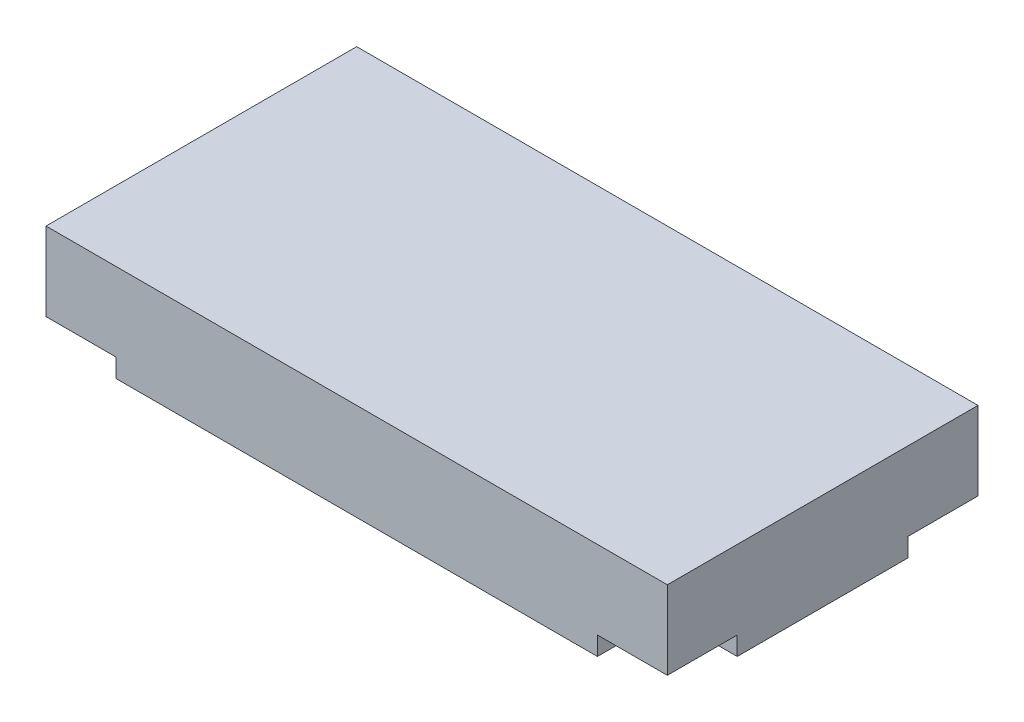
ISO-10303-21;
HEADER;
FILE_DESCRIPTION(('STEP AP214'),'2;1');
FILE_NAME('part.step','',(''),(''),'','','');
FILE_SCHEMA(('AUTOMOTIVE_DESIGN { 1 0 10303 214 1 1 1 1 }'));
ENDSEC;
DATA;
#1=APPLICATION_CONTEXT('core data for automotive mechanical design processes');
#2=APPLICATION_PROTOCOL_DEFINITION('international standard','automotive_design',2000,#1);
#3=PRODUCT_CONTEXT('',#1,'mechanical');
#4=PRODUCT('Part','Part','',(#3));
#5=PRODUCT_RELATED_PRODUCT_CATEGORY('part','',(#4));
#6=PRODUCT_DEFINITION_FORMATION('','',#4);
#7=PRODUCT_DEFINITION_CONTEXT('part definition',#1,'design');
#8=PRODUCT_DEFINITION('design','',#6,#7);
#9=PRODUCT_DEFINITION_SHAPE('','',#8);
#10=(LENGTH_UNIT() NAMED_UNIT(*) SI_UNIT(.MILLI.,.METRE.));
#11=(NAMED_UNIT(*) PLANE_ANGLE_UNIT() SI_UNIT($,.RADIAN.));
#12=(NAMED_UNIT(*) SI_UNIT($,.STERADIAN.) SOLID_ANGLE_UNIT());
#13=UNCERTAINTY_MEASURE_WITH_UNIT(LENGTH_MEASURE(1.E-05),#10,'distance_accuracy_value','');
#14=(GEOMETRIC_REPRESENTATION_CONTEXT(3) GLOBAL_UNCERTAINTY_ASSIGNED_CONTEXT((#13)) GLOBAL_UNIT_ASSIGNED_CONTEXT((#10,
#11,#12)) REPRESENTATION_CONTEXT('',''));
#15=CARTESIAN_POINT('',(0.,0.,0.));
#16=DIRECTION('',(0.,0.,1.));
#17=DIRECTION('',(1.,0.,0.));
#18=AXIS2_PLACEMENT_3D('',#15,#16,#17);
#19=CARTESIAN_POINT('',(20.,6.25,-10.));
#20=DIRECTION('',(-1.,0.,0.));
#21=DIRECTION('',(0.,0.,1.));
#22=AXIS2_PLACEMENT_3D('',#19,#20,#21);
#23=PLANE('',#22);
#24=DIRECTION('',(0.,0.,-1.));
#25=VECTOR('',#24,1.);
#26=CARTESIAN_POINT('',(20.,0.,-10.));
#27=LINE('',#26,#25);
#28=CARTESIAN_POINT('',(20.,0.,5.5));
#29=VERTEX_POINT('',#28);
#30=CARTESIAN_POINT('',(20.,0.,-5.5));
#31=VERTEX_POINT('',#30);
#32=EDGE_CURVE('E290',#29,#31,#27,.T.);
#33=ORIENTED_EDGE('',*,*,#32,.T.);
#34=DIRECTION('',(0.,-1.,0.));
#35=VECTOR('',#34,1.);
#36=CARTESIAN_POINT('',(20.,1.2,-5.5));
#37=LINE('',#36,#35);
#38=CARTESIAN_POINT('',(20.,1.2,-5.5));
#39=VERTEX_POINT('',#38);
#40=EDGE_CURVE('E232',#39,#31,#37,.T.);
#41=ORIENTED_EDGE('',*,*,#40,.F.);
#42=DIRECTION('',(0.,0.,1.));
#43=VECTOR('',#42,1.);
#44=CARTESIAN_POINT('',(20.,1.2,-10.));
#45=LINE('',#44,#43);
#46=CARTESIAN_POINT('',(20.,1.2,-10.));
#47=VERTEX_POINT('',#46);
#48=EDGE_CURVE('E219',#47,#39,#45,.T.);
#49=ORIENTED_EDGE('',*,*,#48,.F.);
#50=DIRECTION('',(0.,-1.,0.));
#51=VECTOR('',#50,1.);
#52=CARTESIAN_POINT('',(20.,6.25,-10.));
#53=LINE('',#52,#51);
#54=CARTESIAN_POINT('',(20.,6.25,-10.));
#55=VERTEX_POINT('',#54);
#56=EDGE_CURVE('E11',#55,#47,#53,.T.);
#57=ORIENTED_EDGE('',*,*,#56,.F.);
#58=DIRECTION('',(0.,0.,-1.));
#59=VECTOR('',#58,1.);
#60=CARTESIAN_POINT('',(20.,6.25,-10.));
#61=LINE('',#60,#59);
#62=CARTESIAN_POINT('',(20.,6.25,10.));
#63=VERTEX_POINT('',#62);
#64=EDGE_CURVE('E296',#63,#55,#61,.T.);
#65=ORIENTED_EDGE('',*,*,#64,.F.);
#66=DIRECTION('',(0.,-1.,0.));
#67=VECTOR('',#66,1.);
#68=CARTESIAN_POINT('',(20.,6.25,10.));
#69=LINE('',#68,#67);
#70=CARTESIAN_POINT('',(20.,1.2,10.));
#71=VERTEX_POINT('',#70);
#72=EDGE_CURVE('E306',#63,#71,#69,.T.);
#73=ORIENTED_EDGE('',*,*,#72,.T.);
#74=DIRECTION('',(0.,0.,1.));
#75=VECTOR('',#74,1.);
#76=CARTESIAN_POINT('',(20.,1.2,10.));
#77=LINE('',#76,#75);
#78=CARTESIAN_POINT('',(20.,1.2,5.5));
#79=VERTEX_POINT('',#78);
#80=EDGE_CURVE('E187',#79,#71,#77,.T.);
#81=ORIENTED_EDGE('',*,*,#80,.F.);
#82=DIRECTION('',(0.,-1.,0.));
#83=VECTOR('',#82,1.);
#84=CARTESIAN_POINT('',(20.,1.2,5.5));
#85=LINE('',#84,#83);
#86=EDGE_CURVE('E178',#79,#29,#85,.T.);
#87=ORIENTED_EDGE('',*,*,#86,.T.);
#88=EDGE_LOOP('',(#33,#41,#49,#57,#65,#73,#81,#87));
#89=FACE_BOUND('',#88,.T.);
#90=ADVANCED_FACE('F32',(#89),#23,.F.);
#91=CARTESIAN_POINT('',(-20.,6.25,-10.));
#92=DIRECTION('',(0.,0.,1.));
#93=DIRECTION('',(1.,0.,0.));
#94=AXIS2_PLACEMENT_3D('',#91,#92,#93);
#95=PLANE('',#94);
#96=DIRECTION('',(-1.,0.,0.));
#97=VECTOR('',#96,1.);
#98=CARTESIAN_POINT('',(-20.,0.,-10.));
#99=LINE('',#98,#97);
#100=CARTESIAN_POINT('',(15.5,0.,-10.));
#101=VERTEX_POINT('',#100);
#102=CARTESIAN_POINT('',(-15.5,0.,-10.));
#103=VERTEX_POINT('',#102);
#104=EDGE_CURVE('E309',#101,#103,#99,.T.);
#105=ORIENTED_EDGE('',*,*,#104,.T.);
#106=DIRECTION('',(0.,-1.,0.));
#107=VECTOR('',#106,1.);
#108=CARTESIAN_POINT('',(-15.5,1.2,-10.));
#109=LINE('',#108,#107);
#110=CARTESIAN_POINT('',(-15.5,1.2,-10.));
#111=VERTEX_POINT('',#110);
#112=EDGE_CURVE('E259',#111,#103,#109,.T.);
#113=ORIENTED_EDGE('',*,*,#112,.F.);
#114=DIRECTION('',(1.,0.,0.));
#115=VECTOR('',#114,1.);
#116=CARTESIAN_POINT('',(-20.,1.2,-10.));
#117=LINE('',#116,#115);
#118=CARTESIAN_POINT('',(-20.,1.2,-10.));
#119=VERTEX_POINT('',#118);
#120=EDGE_CURVE('E247',#119,#111,#117,.T.);
#121=ORIENTED_EDGE('',*,*,#120,.F.);
#122=DIRECTION('',(0.,-1.,0.));
#123=VECTOR('',#122,1.);
#124=CARTESIAN_POINT('',(-20.,6.25,-10.));
#125=LINE('',#124,#123);
#126=CARTESIAN_POINT('',(-20.,6.25,-10.));
#127=VERTEX_POINT('',#126);
#128=EDGE_CURVE('E39',#127,#119,#125,.T.);
#129=ORIENTED_EDGE('',*,*,#128,.F.);
#130=DIRECTION('',(-1.,0.,0.));
#131=VECTOR('',#130,1.);
#132=CARTESIAN_POINT('',(-20.,6.25,-10.));
#133=LINE('',#132,#131);
#134=EDGE_CURVE('E299',#55,#127,#133,.T.);
#135=ORIENTED_EDGE('',*,*,#134,.F.);
#136=ORIENTED_EDGE('',*,*,#56,.T.);
#137=DIRECTION('',(1.,0.,0.));
#138=VECTOR('',#137,1.);
#139=CARTESIAN_POINT('',(20.,1.2,-10.));
#140=LINE('',#139,#138);
#141=CARTESIAN_POINT('',(15.5,1.2,-10.));
#142=VERTEX_POINT('',#141);
#143=EDGE_CURVE('E217',#142,#47,#140,.T.);
#144=ORIENTED_EDGE('',*,*,#143,.F.);
#145=DIRECTION('',(0.,-1.,0.));
#146=VECTOR('',#145,1.);
#147=CARTESIAN_POINT('',(15.5,1.2,-10.));
#148=LINE('',#147,#146);
#149=EDGE_CURVE('E234',#142,#101,#148,.T.);
#150=ORIENTED_EDGE('',*,*,#149,.T.);
#151=EDGE_LOOP('',(#105,#113,#121,#129,#135,#136,#144,#150));
#152=FACE_BOUND('',#151,.T.);
#153=ADVANCED_FACE('F330',(#152),#95,.F.);
#154=CARTESIAN_POINT('',(-20.,6.25,-10.));
#155=DIRECTION('',(1.,0.,0.));
#156=DIRECTION('',(0.,0.,-1.));
#157=AXIS2_PLACEMENT_3D('',#154,#155,#156);
#158=PLANE('',#157);
#159=DIRECTION('',(0.,0.,-1.));
#160=VECTOR('',#159,1.);
#161=CARTESIAN_POINT('',(-20.,1.2,-10.));
#162=LINE('',#161,#160);
#163=CARTESIAN_POINT('',(-20.,1.2,-5.5));
#164=VERTEX_POINT('',#163);
#165=EDGE_CURVE('E245',#164,#119,#162,.T.);
#166=ORIENTED_EDGE('',*,*,#165,.F.);
#167=DIRECTION('',(0.,-1.,0.));
#168=VECTOR('',#167,1.);
#169=CARTESIAN_POINT('',(-20.,1.2,-5.5));
#170=LINE('',#169,#168);
#171=CARTESIAN_POINT('',(-20.,0.,-5.5));
#172=VERTEX_POINT('',#171);
#173=EDGE_CURVE('E261',#164,#172,#170,.T.);
#174=ORIENTED_EDGE('',*,*,#173,.T.);
#175=DIRECTION('',(0.,0.,1.));
#176=VECTOR('',#175,1.);
#177=CARTESIAN_POINT('',(-20.,0.,-10.));
#178=LINE('',#177,#176);
#179=CARTESIAN_POINT('',(-20.,0.,5.5));
#180=VERTEX_POINT('',#179);
#181=EDGE_CURVE('E312',#172,#180,#178,.T.);
#182=ORIENTED_EDGE('',*,*,#181,.T.);
#183=DIRECTION('',(0.,-1.,0.));
#184=VECTOR('',#183,1.);
#185=CARTESIAN_POINT('',(-20.,1.2,5.5));
#186=LINE('',#185,#184);
#187=CARTESIAN_POINT('',(-20.,1.2,5.5));
#188=VERTEX_POINT('',#187);
#189=EDGE_CURVE('E280',#188,#180,#186,.T.);
#190=ORIENTED_EDGE('',*,*,#189,.F.);
#191=DIRECTION('',(0.,0.,-1.));
#192=VECTOR('',#191,1.);
#193=CARTESIAN_POINT('',(-20.,1.2,10.));
#194=LINE('',#193,#192);
#195=CARTESIAN_POINT('',(-20.,1.2,10.));
#196=VERTEX_POINT('',#195);
#197=EDGE_CURVE('E265',#196,#188,#194,.T.);
#198=ORIENTED_EDGE('',*,*,#197,.F.);
#199=DIRECTION('',(0.,-1.,0.));
#200=VECTOR('',#199,1.);
#201=CARTESIAN_POINT('',(-20.,6.25,10.));
#202=LINE('',#201,#200);
#203=CARTESIAN_POINT('',(-20.,6.25,10.));
#204=VERTEX_POINT('',#203);
#205=EDGE_CURVE('E319',#204,#196,#202,.T.);
#206=ORIENTED_EDGE('',*,*,#205,.F.);
#207=DIRECTION('',(0.,0.,1.));
#208=VECTOR('',#207,1.);
#209=CARTESIAN_POINT('',(-20.,6.25,-10.));
#210=LINE('',#209,#208);
#211=EDGE_CURVE('E302',#127,#204,#210,.T.);
#212=ORIENTED_EDGE('',*,*,#211,.F.);
#213=ORIENTED_EDGE('',*,*,#128,.T.);
#214=EDGE_LOOP('',(#166,#174,#182,#190,#198,#206,#212,#213));
#215=FACE_BOUND('',#214,.T.);
#216=ADVANCED_FACE('F326',(#215),#158,.F.);
#217=CARTESIAN_POINT('',(-20.,6.25,10.));
#218=DIRECTION('',(0.,0.,-1.));
#219=DIRECTION('',(-1.,0.,0.));
#220=AXIS2_PLACEMENT_3D('',#217,#218,#219);
#221=PLANE('',#220);
#222=DIRECTION('',(1.,0.,0.));
#223=VECTOR('',#222,1.);
#224=CARTESIAN_POINT('',(-20.,0.,10.));
#225=LINE('',#224,#223);
#226=CARTESIAN_POINT('',(-15.5,0.,10.));
#227=VERTEX_POINT('',#226);
#228=CARTESIAN_POINT('',(15.5,0.,10.));
#229=VERTEX_POINT('',#228);
#230=EDGE_CURVE('E300',#227,#229,#225,.T.);
#231=ORIENTED_EDGE('',*,*,#230,.T.);
#232=DIRECTION('',(0.,-1.,0.));
#233=VECTOR('',#232,1.);
#234=CARTESIAN_POINT('',(15.5,1.2,10.));
#235=LINE('',#234,#233);
#236=CARTESIAN_POINT('',(15.5,1.2,10.));
#237=VERTEX_POINT('',#236);
#238=EDGE_CURVE('E207',#237,#229,#235,.T.);
#239=ORIENTED_EDGE('',*,*,#238,.F.);
#240=DIRECTION('',(-1.,0.,0.));
#241=VECTOR('',#240,1.);
#242=CARTESIAN_POINT('',(20.,1.2,10.));
#243=LINE('',#242,#241);
#244=EDGE_CURVE('E198',#71,#237,#243,.T.);
#245=ORIENTED_EDGE('',*,*,#244,.F.);
#246=ORIENTED_EDGE('',*,*,#72,.F.);
#247=DIRECTION('',(1.,0.,0.));
#248=VECTOR('',#247,1.);
#249=CARTESIAN_POINT('',(-20.,6.25,10.));
#250=LINE('',#249,#248);
#251=EDGE_CURVE('E304',#204,#63,#250,.T.);
#252=ORIENTED_EDGE('',*,*,#251,.F.);
#253=ORIENTED_EDGE('',*,*,#205,.T.);
#254=DIRECTION('',(-1.,0.,0.));
#255=VECTOR('',#254,1.);
#256=CARTESIAN_POINT('',(-20.,1.2,10.));
#257=LINE('',#256,#255);
#258=CARTESIAN_POINT('',(-15.5,1.2,10.));
#259=VERTEX_POINT('',#258);
#260=EDGE_CURVE('E278',#259,#196,#257,.T.);
#261=ORIENTED_EDGE('',*,*,#260,.F.);
#262=DIRECTION('',(0.,-1.,0.));
#263=VECTOR('',#262,1.);
#264=CARTESIAN_POINT('',(-15.5,1.2,10.));
#265=LINE('',#264,#263);
#266=EDGE_CURVE('E287',#259,#227,#265,.T.);
#267=ORIENTED_EDGE('',*,*,#266,.T.);
#268=EDGE_LOOP('',(#231,#239,#245,#246,#252,#253,#261,#267));
#269=FACE_BOUND('',#268,.T.);
#270=ADVANCED_FACE('F359',(#269),#221,.F.);
#271=CARTESIAN_POINT('',(0.,6.25,0.));
#272=DIRECTION('',(0.,1.,0.));
#273=DIRECTION('',(0.,0.,1.));
#274=AXIS2_PLACEMENT_3D('',#271,#272,#273);
#275=PLANE('',#274);
#276=ORIENTED_EDGE('',*,*,#64,.T.);
#277=ORIENTED_EDGE('',*,*,#134,.T.);
#278=ORIENTED_EDGE('',*,*,#211,.T.);
#279=ORIENTED_EDGE('',*,*,#251,.T.);
#280=EDGE_LOOP('',(#276,#277,#278,#279));
#281=FACE_BOUND('',#280,.T.);
#282=ADVANCED_FACE('F364',(#281),#275,.T.);
#283=CARTESIAN_POINT('',(0.,0.,0.));
#284=DIRECTION('',(0.,1.,0.));
#285=DIRECTION('',(0.,0.,1.));
#286=AXIS2_PLACEMENT_3D('',#283,#284,#285);
#287=PLANE('',#286);
#288=CARTESIAN_POINT('',(-17.75,0.,-7.75));
#289=DIRECTION('',(0.,-1.,0.));
#290=DIRECTION('',(0.,0.,-1.));
#291=AXIS2_PLACEMENT_3D('',#288,#289,#290);
#292=CIRCLE('',#291,2.25);
#293=CARTESIAN_POINT('',(-15.5,0.,-7.75000000000001));
#294=VERTEX_POINT('',#293);
#295=CARTESIAN_POINT('',(-17.75,0.,-5.5));
#296=VERTEX_POINT('',#295);
#297=EDGE_CURVE('E46',#294,#296,#292,.T.);
#298=ORIENTED_EDGE('',*,*,#297,.F.);
#299=DIRECTION('',(0.,0.,1.));
#300=VECTOR('',#299,1.);
#301=CARTESIAN_POINT('',(-15.5,0.,-10.));
#302=LINE('',#301,#300);
#303=EDGE_CURVE('E242',#103,#294,#302,.T.);
#304=ORIENTED_EDGE('',*,*,#303,.F.);
#305=ORIENTED_EDGE('',*,*,#104,.F.);
#306=DIRECTION('',(0.,0.,-1.));
#307=VECTOR('',#306,1.);
#308=CARTESIAN_POINT('',(15.5,0.,-10.));
#309=LINE('',#308,#307);
#310=CARTESIAN_POINT('',(15.5,0.,-7.75000000000001));
#311=VERTEX_POINT('',#310);
#312=EDGE_CURVE('E226',#311,#101,#309,.T.);
#313=ORIENTED_EDGE('',*,*,#312,.F.);
#314=CARTESIAN_POINT('',(17.75,0.,-7.75));
#315=DIRECTION('',(0.,-1.,0.));
#316=DIRECTION('',(0.,0.,1.));
#317=AXIS2_PLACEMENT_3D('',#314,#315,#316);
#318=CIRCLE('',#317,2.25);
#319=CARTESIAN_POINT('',(17.75,0.,-5.5));
#320=VERTEX_POINT('',#319);
#321=EDGE_CURVE('E54',#320,#311,#318,.T.);
#322=ORIENTED_EDGE('',*,*,#321,.F.);
#323=DIRECTION('',(-1.,0.,0.));
#324=VECTOR('',#323,1.);
#325=CARTESIAN_POINT('',(20.,0.,-5.5));
#326=LINE('',#325,#324);
#327=EDGE_CURVE('E214',#31,#320,#326,.T.);
#328=ORIENTED_EDGE('',*,*,#327,.F.);
#329=ORIENTED_EDGE('',*,*,#32,.F.);
#330=DIRECTION('',(1.,0.,0.));
#331=VECTOR('',#330,1.);
#332=CARTESIAN_POINT('',(20.,0.,5.5));
#333=LINE('',#332,#331);
#334=CARTESIAN_POINT('',(17.75,0.,5.5));
#335=VERTEX_POINT('',#334);
#336=EDGE_CURVE('E194',#335,#29,#333,.T.);
#337=ORIENTED_EDGE('',*,*,#336,.F.);
#338=CARTESIAN_POINT('',(17.75,0.,7.75));
#339=DIRECTION('',(0.,-1.,0.));
#340=DIRECTION('',(0.,0.,-1.));
#341=AXIS2_PLACEMENT_3D('',#338,#339,#340);
#342=CIRCLE('',#341,2.25);
#343=CARTESIAN_POINT('',(15.5,0.,7.75000000000002));
#344=VERTEX_POINT('',#343);
#345=EDGE_CURVE('E175',#344,#335,#342,.T.);
#346=ORIENTED_EDGE('',*,*,#345,.F.);
#347=DIRECTION('',(0.,0.,-1.));
#348=VECTOR('',#347,1.);
#349=CARTESIAN_POINT('',(15.5,0.,10.));
#350=LINE('',#349,#348);
#351=EDGE_CURVE('E191',#229,#344,#350,.T.);
#352=ORIENTED_EDGE('',*,*,#351,.F.);
#353=ORIENTED_EDGE('',*,*,#230,.F.);
#354=DIRECTION('',(0.,0.,1.));
#355=VECTOR('',#354,1.);
#356=CARTESIAN_POINT('',(-15.5,0.,10.));
#357=LINE('',#356,#355);
#358=CARTESIAN_POINT('',(-15.5,0.,7.75000000000002));
#359=VERTEX_POINT('',#358);
#360=EDGE_CURVE('E269',#359,#227,#357,.T.);
#361=ORIENTED_EDGE('',*,*,#360,.F.);
#362=CARTESIAN_POINT('',(-17.75,0.,7.75));
#363=DIRECTION('',(0.,-1.,0.));
#364=DIRECTION('',(0.,0.,1.));
#365=AXIS2_PLACEMENT_3D('',#362,#363,#364);
#366=CIRCLE('',#365,2.25);
#367=CARTESIAN_POINT('',(-17.75,0.,5.5));
#368=VERTEX_POINT('',#367);
#369=EDGE_CURVE('E283',#368,#359,#366,.T.);
#370=ORIENTED_EDGE('',*,*,#369,.F.);
#371=DIRECTION('',(1.,0.,0.));
#372=VECTOR('',#371,1.);
#373=CARTESIAN_POINT('',(-20.,0.,5.5));
#374=LINE('',#373,#372);
#375=EDGE_CURVE('E206',#180,#368,#374,.T.);
#376=ORIENTED_EDGE('',*,*,#375,.F.);
#377=ORIENTED_EDGE('',*,*,#181,.F.);
#378=DIRECTION('',(-1.,0.,0.));
#379=VECTOR('',#378,1.);
#380=CARTESIAN_POINT('',(-20.,0.,-5.5));
#381=LINE('',#380,#379);
#382=EDGE_CURVE('E254',#296,#172,#381,.T.);
#383=ORIENTED_EDGE('',*,*,#382,.F.);
#384=EDGE_LOOP('',(#298,#304,#305,#313,#322,#328,#329,#337,#346,#352,#353,#361,#370,#376,#377,#383));
#385=FACE_BOUND('',#384,.T.);
#386=ADVANCED_FACE('F348',(#385),#287,.F.);
#387=CARTESIAN_POINT('',(-15.5,1.2,10.));
#388=DIRECTION('',(1.,0.,0.));
#389=DIRECTION('',(0.,0.,-1.));
#390=AXIS2_PLACEMENT_3D('',#387,#388,#389);
#391=PLANE('',#390);
#392=ORIENTED_EDGE('',*,*,#360,.T.);
#393=ORIENTED_EDGE('',*,*,#266,.F.);
#394=DIRECTION('',(0.,0.,1.));
#395=VECTOR('',#394,1.);
#396=CARTESIAN_POINT('',(-15.5,1.2,10.));
#397=LINE('',#396,#395);
#398=CARTESIAN_POINT('',(-15.5,1.2,7.75000000000002));
#399=VERTEX_POINT('',#398);
#400=EDGE_CURVE('E275',#399,#259,#397,.T.);
#401=ORIENTED_EDGE('',*,*,#400,.F.);
#402=DIRECTION('',(0.,-1.,0.));
#403=VECTOR('',#402,1.);
#404=CARTESIAN_POINT('',(-15.5,1.2,7.75000000000002));
#405=LINE('',#404,#403);
#406=EDGE_CURVE('E291',#399,#359,#405,.T.);
#407=ORIENTED_EDGE('',*,*,#406,.T.);
#408=EDGE_LOOP('',(#392,#393,#401,#407));
#409=FACE_BOUND('',#408,.T.);
#410=ADVANCED_FACE('F388',(#409),#391,.F.);
#411=CARTESIAN_POINT('',(-17.75,1.2,7.75));
#412=DIRECTION('',(0.,-1.,0.));
#413=DIRECTION('',(0.,0.,-1.));
#414=AXIS2_PLACEMENT_3D('',#411,#412,#413);
#415=CYLINDRICAL_SURFACE('',#414,2.25);
#416=ORIENTED_EDGE('',*,*,#369,.T.);
#417=ORIENTED_EDGE('',*,*,#406,.F.);
#418=CARTESIAN_POINT('',(-17.75,1.2,7.75));
#419=DIRECTION('',(0.,-1.,0.));
#420=DIRECTION('',(0.,0.,1.));
#421=AXIS2_PLACEMENT_3D('',#418,#419,#420);
#422=CIRCLE('',#421,2.25);
#423=CARTESIAN_POINT('',(-17.75,1.2,5.5));
#424=VERTEX_POINT('',#423);
#425=EDGE_CURVE('E272',#424,#399,#422,.T.);
#426=ORIENTED_EDGE('',*,*,#425,.F.);
#427=DIRECTION('',(0.,-1.,0.));
#428=VECTOR('',#427,1.);
#429=CARTESIAN_POINT('',(-17.75,1.2,5.5));
#430=LINE('',#429,#428);
#431=EDGE_CURVE('E293',#424,#368,#430,.T.);
#432=ORIENTED_EDGE('',*,*,#431,.T.);
#433=EDGE_LOOP('',(#416,#417,#426,#432));
#434=FACE_BOUND('',#433,.T.);
#435=ADVANCED_FACE('F391',(#434),#415,.F.);
#436=CARTESIAN_POINT('',(-20.,1.2,5.5));
#437=DIRECTION('',(0.,0.,-1.));
#438=DIRECTION('',(-1.,0.,0.));
#439=AXIS2_PLACEMENT_3D('',#436,#437,#438);
#440=PLANE('',#439);
#441=ORIENTED_EDGE('',*,*,#375,.T.);
#442=ORIENTED_EDGE('',*,*,#431,.F.);
#443=DIRECTION('',(1.,0.,0.));
#444=VECTOR('',#443,1.);
#445=CARTESIAN_POINT('',(-20.,1.2,5.5));
#446=LINE('',#445,#444);
#447=EDGE_CURVE('E268',#188,#424,#446,.T.);
#448=ORIENTED_EDGE('',*,*,#447,.F.);
#449=ORIENTED_EDGE('',*,*,#189,.T.);
#450=EDGE_LOOP('',(#441,#442,#448,#449));
#451=FACE_BOUND('',#450,.T.);
#452=ADVANCED_FACE('F352',(#451),#440,.F.);
#453=CARTESIAN_POINT('',(-17.75,1.2,7.75));
#454=DIRECTION('',(0.,1.,0.));
#455=DIRECTION('',(0.,0.,1.));
#456=AXIS2_PLACEMENT_3D('',#453,#454,#455);
#457=PLANE('',#456);
#458=ORIENTED_EDGE('',*,*,#197,.T.);
#459=ORIENTED_EDGE('',*,*,#447,.T.);
#460=ORIENTED_EDGE('',*,*,#425,.T.);
#461=ORIENTED_EDGE('',*,*,#400,.T.);
#462=ORIENTED_EDGE('',*,*,#260,.T.);
#463=EDGE_LOOP('',(#458,#459,#460,#461,#462));
#464=FACE_BOUND('',#463,.T.);
#465=ADVANCED_FACE('F392',(#464),#457,.F.);
#466=CARTESIAN_POINT('',(17.75,1.2,7.75));
#467=DIRECTION('',(0.,-1.,0.));
#468=DIRECTION('',(0.,0.,-1.));
#469=AXIS2_PLACEMENT_3D('',#466,#467,#468);
#470=CYLINDRICAL_SURFACE('',#469,2.25);
#471=ORIENTED_EDGE('',*,*,#345,.T.);
#472=DIRECTION('',(0.,-1.,0.));
#473=VECTOR('',#472,1.);
#474=CARTESIAN_POINT('',(17.75,1.2,5.5));
#475=LINE('',#474,#473);
#476=CARTESIAN_POINT('',(17.75,1.2,5.5));
#477=VERTEX_POINT('',#476);
#478=EDGE_CURVE('E168',#477,#335,#475,.T.);
#479=ORIENTED_EDGE('',*,*,#478,.F.);
#480=CARTESIAN_POINT('',(17.75,1.2,7.75));
#481=DIRECTION('',(0.,-1.,0.));
#482=DIRECTION('',(0.,0.,-1.));
#483=AXIS2_PLACEMENT_3D('',#480,#481,#482);
#484=CIRCLE('',#483,2.25);
#485=CARTESIAN_POINT('',(15.5,1.2,7.75000000000002));
#486=VERTEX_POINT('',#485);
#487=EDGE_CURVE('E172',#486,#477,#484,.T.);
#488=ORIENTED_EDGE('',*,*,#487,.F.);
#489=DIRECTION('',(0.,-1.,0.));
#490=VECTOR('',#489,1.);
#491=CARTESIAN_POINT('',(15.5,1.2,7.75000000000002));
#492=LINE('',#491,#490);
#493=EDGE_CURVE('E204',#486,#344,#492,.T.);
#494=ORIENTED_EDGE('',*,*,#493,.T.);
#495=EDGE_LOOP('',(#471,#479,#488,#494));
#496=FACE_BOUND('',#495,.T.);
#497=ADVANCED_FACE('F170',(#496),#470,.F.);
#498=CARTESIAN_POINT('',(15.5,1.2,10.));
#499=DIRECTION('',(-1.,0.,0.));
#500=DIRECTION('',(0.,0.,1.));
#501=AXIS2_PLACEMENT_3D('',#498,#499,#500);
#502=PLANE('',#501);
#503=ORIENTED_EDGE('',*,*,#351,.T.);
#504=ORIENTED_EDGE('',*,*,#493,.F.);
#505=DIRECTION('',(0.,0.,-1.));
#506=VECTOR('',#505,1.);
#507=CARTESIAN_POINT('',(15.5,1.2,10.));
#508=LINE('',#507,#506);
#509=EDGE_CURVE('E179',#237,#486,#508,.T.);
#510=ORIENTED_EDGE('',*,*,#509,.F.);
#511=ORIENTED_EDGE('',*,*,#238,.T.);
#512=EDGE_LOOP('',(#503,#504,#510,#511));
#513=FACE_BOUND('',#512,.T.);
#514=ADVANCED_FACE('F386',(#513),#502,.F.);
#515=CARTESIAN_POINT('',(20.,1.2,5.5));
#516=DIRECTION('',(0.,0.,-1.));
#517=DIRECTION('',(-1.,0.,0.));
#518=AXIS2_PLACEMENT_3D('',#515,#516,#517);
#519=PLANE('',#518);
#520=ORIENTED_EDGE('',*,*,#336,.T.);
#521=ORIENTED_EDGE('',*,*,#86,.F.);
#522=DIRECTION('',(1.,0.,0.));
#523=VECTOR('',#522,1.);
#524=CARTESIAN_POINT('',(20.,1.2,5.5));
#525=LINE('',#524,#523);
#526=EDGE_CURVE('E182',#477,#79,#525,.T.);
#527=ORIENTED_EDGE('',*,*,#526,.F.);
#528=ORIENTED_EDGE('',*,*,#478,.T.);
#529=EDGE_LOOP('',(#520,#521,#527,#528));
#530=FACE_BOUND('',#529,.T.);
#531=ADVANCED_FACE('F183',(#530),#519,.F.);
#532=CARTESIAN_POINT('',(17.75,1.2,7.75));
#533=DIRECTION('',(0.,-1.,0.));
#534=DIRECTION('',(0.,0.,-1.));
#535=AXIS2_PLACEMENT_3D('',#532,#533,#534);
#536=PLANE('',#535);
#537=ORIENTED_EDGE('',*,*,#487,.T.);
#538=ORIENTED_EDGE('',*,*,#526,.T.);
#539=ORIENTED_EDGE('',*,*,#80,.T.);
#540=ORIENTED_EDGE('',*,*,#244,.T.);
#541=ORIENTED_EDGE('',*,*,#509,.T.);
#542=EDGE_LOOP('',(#537,#538,#539,#540,#541));
#543=FACE_BOUND('',#542,.T.);
#544=ADVANCED_FACE('F189',(#543),#536,.T.);
#545=CARTESIAN_POINT('',(17.75,1.2,-7.75));
#546=DIRECTION('',(0.,-1.,0.));
#547=DIRECTION('',(0.,0.,-1.));
#548=AXIS2_PLACEMENT_3D('',#545,#546,#547);
#549=CYLINDRICAL_SURFACE('',#548,2.25);
#550=ORIENTED_EDGE('',*,*,#321,.T.);
#551=DIRECTION('',(0.,-1.,0.));
#552=VECTOR('',#551,1.);
#553=CARTESIAN_POINT('',(15.5,1.2,-7.75000000000001));
#554=LINE('',#553,#552);
#555=CARTESIAN_POINT('',(15.5,1.2,-7.75000000000001));
#556=VERTEX_POINT('',#555);
#557=EDGE_CURVE('E224',#556,#311,#554,.T.);
#558=ORIENTED_EDGE('',*,*,#557,.F.);
#559=CARTESIAN_POINT('',(17.75,1.2,-7.75));
#560=DIRECTION('',(0.,-1.,0.));
#561=DIRECTION('',(0.,0.,1.));
#562=AXIS2_PLACEMENT_3D('',#559,#560,#561);
#563=CIRCLE('',#562,2.25);
#564=CARTESIAN_POINT('',(17.75,1.2,-5.5));
#565=VERTEX_POINT('',#564);
#566=EDGE_CURVE('E210',#565,#556,#563,.T.);
#567=ORIENTED_EDGE('',*,*,#566,.F.);
#568=DIRECTION('',(0.,-1.,0.));
#569=VECTOR('',#568,1.);
#570=CARTESIAN_POINT('',(17.75,1.2,-5.5));
#571=LINE('',#570,#569);
#572=EDGE_CURVE('E202',#565,#320,#571,.T.);
#573=ORIENTED_EDGE('',*,*,#572,.T.);
#574=EDGE_LOOP('',(#550,#558,#567,#573));
#575=FACE_BOUND('',#574,.T.);
#576=ADVANCED_FACE('F467',(#575),#549,.F.);
#577=CARTESIAN_POINT('',(20.,1.2,-5.5));
#578=DIRECTION('',(0.,0.,1.));
#579=DIRECTION('',(1.,0.,0.));
#580=AXIS2_PLACEMENT_3D('',#577,#578,#579);
#581=PLANE('',#580);
#582=ORIENTED_EDGE('',*,*,#327,.T.);
#583=ORIENTED_EDGE('',*,*,#572,.F.);
#584=DIRECTION('',(-1.,0.,0.));
#585=VECTOR('',#584,1.);
#586=CARTESIAN_POINT('',(20.,1.2,-5.5));
#587=LINE('',#586,#585);
#588=EDGE_CURVE('E221',#39,#565,#587,.T.);
#589=ORIENTED_EDGE('',*,*,#588,.F.);
#590=ORIENTED_EDGE('',*,*,#40,.T.);
#591=EDGE_LOOP('',(#582,#583,#589,#590));
#592=FACE_BOUND('',#591,.T.);
#593=ADVANCED_FACE('F476',(#592),#581,.F.);
#594=CARTESIAN_POINT('',(15.5,1.2,-10.));
#595=DIRECTION('',(-1.,0.,0.));
#596=DIRECTION('',(0.,0.,1.));
#597=AXIS2_PLACEMENT_3D('',#594,#595,#596);
#598=PLANE('',#597);
#599=ORIENTED_EDGE('',*,*,#312,.T.);
#600=ORIENTED_EDGE('',*,*,#149,.F.);
#601=DIRECTION('',(0.,0.,-1.));
#602=VECTOR('',#601,1.);
#603=CARTESIAN_POINT('',(15.5,1.2,-10.));
#604=LINE('',#603,#602);
#605=EDGE_CURVE('E213',#556,#142,#604,.T.);
#606=ORIENTED_EDGE('',*,*,#605,.F.);
#607=ORIENTED_EDGE('',*,*,#557,.T.);
#608=EDGE_LOOP('',(#599,#600,#606,#607));
#609=FACE_BOUND('',#608,.T.);
#610=ADVANCED_FACE('F377',(#609),#598,.F.);
#611=CARTESIAN_POINT('',(17.75,1.2,-7.75));
#612=DIRECTION('',(0.,1.,0.));
#613=DIRECTION('',(0.,0.,1.));
#614=AXIS2_PLACEMENT_3D('',#611,#612,#613);
#615=PLANE('',#614);
#616=ORIENTED_EDGE('',*,*,#566,.T.);
#617=ORIENTED_EDGE('',*,*,#605,.T.);
#618=ORIENTED_EDGE('',*,*,#143,.T.);
#619=ORIENTED_EDGE('',*,*,#48,.T.);
#620=ORIENTED_EDGE('',*,*,#588,.T.);
#621=EDGE_LOOP('',(#616,#617,#618,#619,#620));
#622=FACE_BOUND('',#621,.T.);
#623=ADVANCED_FACE('F372',(#622),#615,.F.);
#624=CARTESIAN_POINT('',(-17.75,1.2,-7.75));
#625=DIRECTION('',(0.,-1.,0.));
#626=DIRECTION('',(0.,0.,-1.));
#627=AXIS2_PLACEMENT_3D('',#624,#625,#626);
#628=CYLINDRICAL_SURFACE('',#627,2.25);
#629=ORIENTED_EDGE('',*,*,#297,.T.);
#630=DIRECTION('',(0.,-1.,0.));
#631=VECTOR('',#630,1.);
#632=CARTESIAN_POINT('',(-17.75,1.2,-5.5));
#633=LINE('',#632,#631);
#634=CARTESIAN_POINT('',(-17.75,1.2,-5.5));
#635=VERTEX_POINT('',#634);
#636=EDGE_CURVE('E252',#635,#296,#633,.T.);
#637=ORIENTED_EDGE('',*,*,#636,.F.);
#638=CARTESIAN_POINT('',(-17.75,1.2,-7.75));
#639=DIRECTION('',(0.,-1.,0.));
#640=DIRECTION('',(0.,0.,-1.));
#641=AXIS2_PLACEMENT_3D('',#638,#639,#640);
#642=CIRCLE('',#641,2.25);
#643=CARTESIAN_POINT('',(-15.5,1.2,-7.75000000000001));
#644=VERTEX_POINT('',#643);
#645=EDGE_CURVE('E238',#644,#635,#642,.T.);
#646=ORIENTED_EDGE('',*,*,#645,.F.);
#647=DIRECTION('',(0.,-1.,0.));
#648=VECTOR('',#647,1.);
#649=CARTESIAN_POINT('',(-15.5,1.2,-7.75000000000001));
#650=LINE('',#649,#648);
#651=EDGE_CURVE('E227',#644,#294,#650,.T.);
#652=ORIENTED_EDGE('',*,*,#651,.T.);
#653=EDGE_LOOP('',(#629,#637,#646,#652));
#654=FACE_BOUND('',#653,.T.);
#655=ADVANCED_FACE('F339',(#654),#628,.F.);
#656=CARTESIAN_POINT('',(-15.5,1.2,-10.));
#657=DIRECTION('',(1.,0.,0.));
#658=DIRECTION('',(0.,0.,-1.));
#659=AXIS2_PLACEMENT_3D('',#656,#657,#658);
#660=PLANE('',#659);
#661=ORIENTED_EDGE('',*,*,#303,.T.);
#662=ORIENTED_EDGE('',*,*,#651,.F.);
#663=DIRECTION('',(0.,0.,1.));
#664=VECTOR('',#663,1.);
#665=CARTESIAN_POINT('',(-15.5,1.2,-10.));
#666=LINE('',#665,#664);
#667=EDGE_CURVE('E249',#111,#644,#666,.T.);
#668=ORIENTED_EDGE('',*,*,#667,.F.);
#669=ORIENTED_EDGE('',*,*,#112,.T.);
#670=EDGE_LOOP('',(#661,#662,#668,#669));
#671=FACE_BOUND('',#670,.T.);
#672=ADVANCED_FACE('F336',(#671),#660,.F.);
#673=CARTESIAN_POINT('',(-20.,1.2,-5.5));
#674=DIRECTION('',(0.,0.,1.));
#675=DIRECTION('',(1.,0.,0.));
#676=AXIS2_PLACEMENT_3D('',#673,#674,#675);
#677=PLANE('',#676);
#678=ORIENTED_EDGE('',*,*,#382,.T.);
#679=ORIENTED_EDGE('',*,*,#173,.F.);
#680=DIRECTION('',(-1.,0.,0.));
#681=VECTOR('',#680,1.);
#682=CARTESIAN_POINT('',(-20.,1.2,-5.5));
#683=LINE('',#682,#681);
#684=EDGE_CURVE('E241',#635,#164,#683,.T.);
#685=ORIENTED_EDGE('',*,*,#684,.F.);
#686=ORIENTED_EDGE('',*,*,#636,.T.);
#687=EDGE_LOOP('',(#678,#679,#685,#686));
#688=FACE_BOUND('',#687,.T.);
#689=ADVANCED_FACE('F342',(#688),#677,.F.);
#690=CARTESIAN_POINT('',(-17.75,1.2,-7.75));
#691=DIRECTION('',(0.,-1.,0.));
#692=DIRECTION('',(0.,0.,-1.));
#693=AXIS2_PLACEMENT_3D('',#690,#691,#692);
#694=PLANE('',#693);
#695=ORIENTED_EDGE('',*,*,#645,.T.);
#696=ORIENTED_EDGE('',*,*,#684,.T.);
#697=ORIENTED_EDGE('',*,*,#165,.T.);
#698=ORIENTED_EDGE('',*,*,#120,.T.);
#699=ORIENTED_EDGE('',*,*,#667,.T.);
#700=EDGE_LOOP('',(#695,#696,#697,#698,#699));
#701=FACE_BOUND('',#700,.T.);
#702=ADVANCED_FACE('F334',(#701),#694,.T.);
#703=CLOSED_SHELL('',(#90,#153,#216,#270,#282,#386,#410,#435,#452,#465,#497,#514,#531,#544,#576,
#593,#610,#623,#655,#672,#689,#702));
#704=MANIFOLD_SOLID_BREP('B2',#703);
#705=ADVANCED_BREP_SHAPE_REPRESENTATION('',(#18,#704),#14);
#706=SHAPE_DEFINITION_REPRESENTATION(#9,#705);
ENDSEC;
END-ISO-10303-21;
